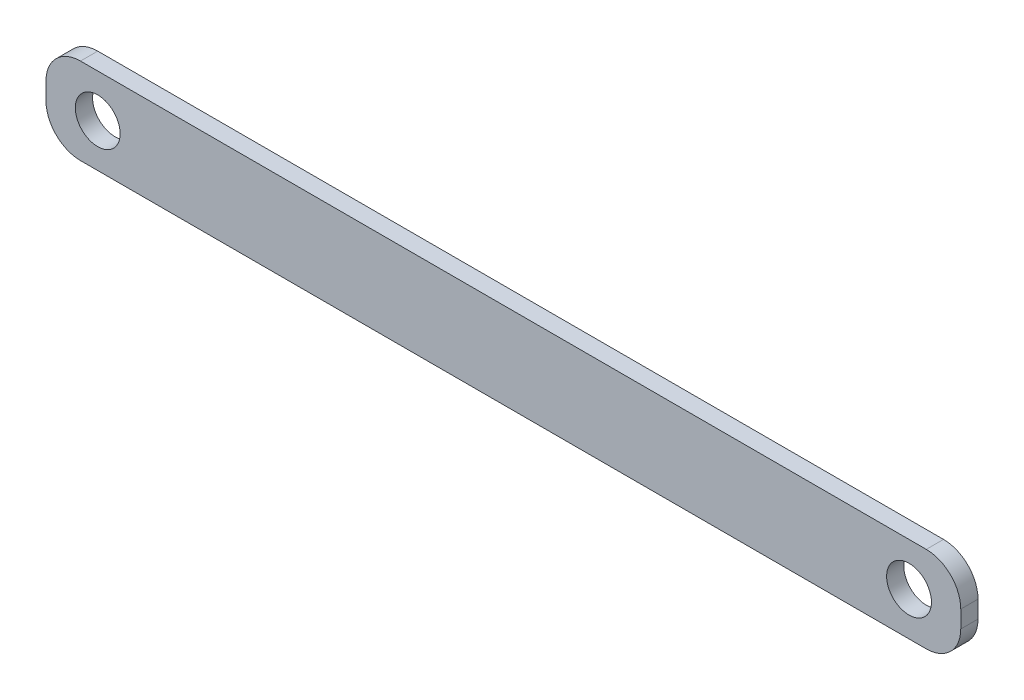
ISO-10303-21;
HEADER;
FILE_DESCRIPTION(('STEP AP214'),'2;1');
FILE_NAME('part.step','',(''),(''),'','','');
FILE_SCHEMA(('AUTOMOTIVE_DESIGN { 1 0 10303 214 1 1 1 1 }'));
ENDSEC;
DATA;
#1=APPLICATION_CONTEXT('core data for automotive mechanical design processes');
#2=APPLICATION_PROTOCOL_DEFINITION('international standard','automotive_design',2000,#1);
#3=PRODUCT_CONTEXT('',#1,'mechanical');
#4=PRODUCT('Part','Part','',(#3));
#5=PRODUCT_RELATED_PRODUCT_CATEGORY('part','',(#4));
#6=PRODUCT_DEFINITION_FORMATION('','',#4);
#7=PRODUCT_DEFINITION_CONTEXT('part definition',#1,'design');
#8=PRODUCT_DEFINITION('design','',#6,#7);
#9=PRODUCT_DEFINITION_SHAPE('','',#8);
#10=(LENGTH_UNIT() NAMED_UNIT(*) SI_UNIT(.MILLI.,.METRE.));
#11=(NAMED_UNIT(*) PLANE_ANGLE_UNIT() SI_UNIT($,.RADIAN.));
#12=(NAMED_UNIT(*) SI_UNIT($,.STERADIAN.) SOLID_ANGLE_UNIT());
#13=UNCERTAINTY_MEASURE_WITH_UNIT(LENGTH_MEASURE(1.E-05),#10,'distance_accuracy_value','');
#14=(GEOMETRIC_REPRESENTATION_CONTEXT(3) GLOBAL_UNCERTAINTY_ASSIGNED_CONTEXT((#13)) GLOBAL_UNIT_ASSIGNED_CONTEXT((#10,
#11,#12)) REPRESENTATION_CONTEXT('',''));
#15=CARTESIAN_POINT('',(0.,0.,0.));
#16=DIRECTION('',(0.,0.,1.));
#17=DIRECTION('',(1.,0.,0.));
#18=AXIS2_PLACEMENT_3D('',#15,#16,#17);
#19=CARTESIAN_POINT('',(120.,-2.5,2.5));
#20=DIRECTION('',(0.,0.,1.));
#21=DIRECTION('',(1.,0.,0.));
#22=AXIS2_PLACEMENT_3D('',#19,#20,#21);
#23=PLANE('',#22);
#24=CARTESIAN_POINT('',(115.,0.,2.5));
#25=DIRECTION('',(0.,0.,1.));
#26=DIRECTION('',(1.,0.,0.));
#27=AXIS2_PLACEMENT_3D('',#24,#25,#26);
#28=CIRCLE('',#27,6.50000000000002);
#29=CARTESIAN_POINT('',(121.5,0.,2.5));
#30=VERTEX_POINT('',#29);
#31=EDGE_CURVE('E134',#30,#30,#28,.T.);
#32=ORIENTED_EDGE('',*,*,#31,.F.);
#33=EDGE_LOOP('',(#32));
#34=FACE_BOUND('',#33,.T.);
#35=CARTESIAN_POINT('',(120.,-2.5,2.5));
#36=DIRECTION('',(0.,0.,1.));
#37=DIRECTION('',(1.,0.,0.));
#38=AXIS2_PLACEMENT_3D('',#35,#36,#37);
#39=CIRCLE('',#38,10.);
#40=CARTESIAN_POINT('',(120.,-12.5,2.5));
#41=VERTEX_POINT('',#40);
#42=CARTESIAN_POINT('',(130.,-2.5,2.5));
#43=VERTEX_POINT('',#42);
#44=EDGE_CURVE('E145',#41,#43,#39,.T.);
#45=ORIENTED_EDGE('',*,*,#44,.T.);
#46=DIRECTION('',(0.,1.,0.));
#47=VECTOR('',#46,1.);
#48=CARTESIAN_POINT('',(130.,2.4999999999999,2.5));
#49=LINE('',#48,#47);
#50=CARTESIAN_POINT('',(130.,2.4999999999999,2.5));
#51=VERTEX_POINT('',#50);
#52=EDGE_CURVE('E93',#43,#51,#49,.T.);
#53=ORIENTED_EDGE('',*,*,#52,.T.);
#54=CARTESIAN_POINT('',(120.,2.4999999999999,2.5));
#55=DIRECTION('',(0.,0.,1.));
#56=DIRECTION('',(-1.,0.,0.));
#57=AXIS2_PLACEMENT_3D('',#54,#55,#56);
#58=CIRCLE('',#57,10.);
#59=CARTESIAN_POINT('',(120.,12.4999999999999,2.5));
#60=VERTEX_POINT('',#59);
#61=EDGE_CURVE('E160',#51,#60,#58,.T.);
#62=ORIENTED_EDGE('',*,*,#61,.T.);
#63=DIRECTION('',(-1.,0.,0.));
#64=VECTOR('',#63,1.);
#65=CARTESIAN_POINT('',(-125.22896295,12.4999999999999,2.5));
#66=LINE('',#65,#64);
#67=CARTESIAN_POINT('',(-125.22896295,12.4999999999999,2.5));
#68=VERTEX_POINT('',#67);
#69=EDGE_CURVE('E173',#60,#68,#66,.T.);
#70=ORIENTED_EDGE('',*,*,#69,.T.);
#71=CARTESIAN_POINT('',(-125.22896295,2.4999999999999,2.5));
#72=DIRECTION('',(0.,0.,1.));
#73=DIRECTION('',(1.,0.,0.));
#74=AXIS2_PLACEMENT_3D('',#71,#72,#73);
#75=CIRCLE('',#74,10.);
#76=CARTESIAN_POINT('',(-135.22896295,2.4999999999999,2.5));
#77=VERTEX_POINT('',#76);
#78=EDGE_CURVE('E112',#68,#77,#75,.T.);
#79=ORIENTED_EDGE('',*,*,#78,.T.);
#80=DIRECTION('',(0.,-1.,0.));
#81=VECTOR('',#80,1.);
#82=CARTESIAN_POINT('',(-135.22896295,2.4999999999999,2.5));
#83=LINE('',#82,#81);
#84=CARTESIAN_POINT('',(-135.22896295,-2.5,2.5));
#85=VERTEX_POINT('',#84);
#86=EDGE_CURVE('E106',#77,#85,#83,.T.);
#87=ORIENTED_EDGE('',*,*,#86,.T.);
#88=CARTESIAN_POINT('',(-125.22896295,-2.5,2.5));
#89=DIRECTION('',(0.,0.,1.));
#90=DIRECTION('',(1.,0.,0.));
#91=AXIS2_PLACEMENT_3D('',#88,#89,#90);
#92=CIRCLE('',#91,10.);
#93=CARTESIAN_POINT('',(-125.22896295,-12.5,2.5));
#94=VERTEX_POINT('',#93);
#95=EDGE_CURVE('E110',#85,#94,#92,.T.);
#96=ORIENTED_EDGE('',*,*,#95,.T.);
#97=DIRECTION('',(1.,0.,0.));
#98=VECTOR('',#97,1.);
#99=CARTESIAN_POINT('',(-125.22896295,-12.5,2.5));
#100=LINE('',#99,#98);
#101=EDGE_CURVE('E50',#94,#41,#100,.T.);
#102=ORIENTED_EDGE('',*,*,#101,.T.);
#103=EDGE_LOOP('',(#45,#53,#62,#70,#79,#87,#96,#102));
#104=FACE_BOUND('',#103,.T.);
#105=CARTESIAN_POINT('',(-120.22896295,0.,2.5));
#106=DIRECTION('',(0.,0.,1.));
#107=DIRECTION('',(1.,0.,0.));
#108=AXIS2_PLACEMENT_3D('',#105,#106,#107);
#109=CIRCLE('',#108,6.5);
#110=CARTESIAN_POINT('',(-113.72896295,0.,2.5));
#111=VERTEX_POINT('',#110);
#112=EDGE_CURVE('E182',#111,#111,#109,.T.);
#113=ORIENTED_EDGE('',*,*,#112,.F.);
#114=EDGE_LOOP('',(#113));
#115=FACE_BOUND('',#114,.T.);
#116=ADVANCED_FACE('F33',(#34,#104,#115),#23,.T.);
#117=CARTESIAN_POINT('',(120.,-2.5,-2.5));
#118=DIRECTION('',(0.,0.,1.));
#119=DIRECTION('',(1.,0.,0.));
#120=AXIS2_PLACEMENT_3D('',#117,#118,#119);
#121=PLANE('',#120);
#122=CARTESIAN_POINT('',(120.,-2.5,-2.5));
#123=DIRECTION('',(0.,0.,1.));
#124=DIRECTION('',(1.,0.,0.));
#125=AXIS2_PLACEMENT_3D('',#122,#123,#124);
#126=CIRCLE('',#125,10.);
#127=CARTESIAN_POINT('',(120.,-12.5,-2.5));
#128=VERTEX_POINT('',#127);
#129=CARTESIAN_POINT('',(130.,-2.5,-2.5));
#130=VERTEX_POINT('',#129);
#131=EDGE_CURVE('E130',#128,#130,#126,.T.);
#132=ORIENTED_EDGE('',*,*,#131,.F.);
#133=DIRECTION('',(1.,0.,0.));
#134=VECTOR('',#133,1.);
#135=CARTESIAN_POINT('',(-125.22896295,-12.5,-2.5));
#136=LINE('',#135,#134);
#137=CARTESIAN_POINT('',(-125.22896295,-12.5,-2.5));
#138=VERTEX_POINT('',#137);
#139=EDGE_CURVE('E85',#138,#128,#136,.T.);
#140=ORIENTED_EDGE('',*,*,#139,.F.);
#141=CARTESIAN_POINT('',(-125.22896295,-2.5,-2.5));
#142=DIRECTION('',(0.,0.,1.));
#143=DIRECTION('',(1.,0.,0.));
#144=AXIS2_PLACEMENT_3D('',#141,#142,#143);
#145=CIRCLE('',#144,10.);
#146=CARTESIAN_POINT('',(-135.22896295,-2.5,-2.5));
#147=VERTEX_POINT('',#146);
#148=EDGE_CURVE('E79',#147,#138,#145,.T.);
#149=ORIENTED_EDGE('',*,*,#148,.F.);
#150=DIRECTION('',(0.,-1.,0.));
#151=VECTOR('',#150,1.);
#152=CARTESIAN_POINT('',(-135.22896295,2.4999999999999,-2.5));
#153=LINE('',#152,#151);
#154=CARTESIAN_POINT('',(-135.22896295,2.4999999999999,-2.5));
#155=VERTEX_POINT('',#154);
#156=EDGE_CURVE('E120',#155,#147,#153,.T.);
#157=ORIENTED_EDGE('',*,*,#156,.F.);
#158=CARTESIAN_POINT('',(-125.22896295,2.4999999999999,-2.5));
#159=DIRECTION('',(0.,0.,1.));
#160=DIRECTION('',(1.,0.,0.));
#161=AXIS2_PLACEMENT_3D('',#158,#159,#160);
#162=CIRCLE('',#161,10.);
#163=CARTESIAN_POINT('',(-125.22896295,12.4999999999999,-2.5));
#164=VERTEX_POINT('',#163);
#165=EDGE_CURVE('E140',#164,#155,#162,.T.);
#166=ORIENTED_EDGE('',*,*,#165,.F.);
#167=DIRECTION('',(-1.,0.,0.));
#168=VECTOR('',#167,1.);
#169=CARTESIAN_POINT('',(-125.22896295,12.4999999999999,-2.5));
#170=LINE('',#169,#168);
#171=CARTESIAN_POINT('',(120.,12.4999999999999,-2.5));
#172=VERTEX_POINT('',#171);
#173=EDGE_CURVE('E138',#172,#164,#170,.T.);
#174=ORIENTED_EDGE('',*,*,#173,.F.);
#175=CARTESIAN_POINT('',(120.,2.4999999999999,-2.5));
#176=DIRECTION('',(0.,0.,1.));
#177=DIRECTION('',(-1.,0.,0.));
#178=AXIS2_PLACEMENT_3D('',#175,#176,#177);
#179=CIRCLE('',#178,10.);
#180=CARTESIAN_POINT('',(130.,2.4999999999999,-2.5));
#181=VERTEX_POINT('',#180);
#182=EDGE_CURVE('E136',#181,#172,#179,.T.);
#183=ORIENTED_EDGE('',*,*,#182,.F.);
#184=DIRECTION('',(0.,1.,0.));
#185=VECTOR('',#184,1.);
#186=CARTESIAN_POINT('',(130.,2.4999999999999,-2.5));
#187=LINE('',#186,#185);
#188=EDGE_CURVE('E133',#130,#181,#187,.T.);
#189=ORIENTED_EDGE('',*,*,#188,.F.);
#190=EDGE_LOOP('',(#132,#140,#149,#157,#166,#174,#183,#189));
#191=FACE_BOUND('',#190,.T.);
#192=CARTESIAN_POINT('',(115.,0.,-2.5));
#193=DIRECTION('',(0.,0.,1.));
#194=DIRECTION('',(1.,0.,0.));
#195=AXIS2_PLACEMENT_3D('',#192,#193,#194);
#196=CIRCLE('',#195,6.50000000000002);
#197=CARTESIAN_POINT('',(121.5,0.,-2.5));
#198=VERTEX_POINT('',#197);
#199=EDGE_CURVE('E179',#198,#198,#196,.T.);
#200=ORIENTED_EDGE('',*,*,#199,.T.);
#201=EDGE_LOOP('',(#200));
#202=FACE_BOUND('',#201,.T.);
#203=CARTESIAN_POINT('',(-120.22896295,0.,-2.5));
#204=DIRECTION('',(0.,0.,1.));
#205=DIRECTION('',(1.,0.,0.));
#206=AXIS2_PLACEMENT_3D('',#203,#204,#205);
#207=CIRCLE('',#206,6.5);
#208=CARTESIAN_POINT('',(-113.72896295,0.,-2.5));
#209=VERTEX_POINT('',#208);
#210=EDGE_CURVE('E185',#209,#209,#207,.T.);
#211=ORIENTED_EDGE('',*,*,#210,.T.);
#212=EDGE_LOOP('',(#211));
#213=FACE_BOUND('',#212,.T.);
#214=ADVANCED_FACE('F164',(#191,#202,#213),#121,.F.);
#215=CARTESIAN_POINT('',(120.,-2.5,2.5));
#216=DIRECTION('',(0.,0.,-1.));
#217=DIRECTION('',(-1.,0.,0.));
#218=AXIS2_PLACEMENT_3D('',#215,#216,#217);
#219=CYLINDRICAL_SURFACE('',#218,10.);
#220=ORIENTED_EDGE('',*,*,#131,.T.);
#221=DIRECTION('',(0.,0.,-1.));
#222=VECTOR('',#221,1.);
#223=CARTESIAN_POINT('',(130.,-2.5,2.5));
#224=LINE('',#223,#222);
#225=EDGE_CURVE('E11',#43,#130,#224,.T.);
#226=ORIENTED_EDGE('',*,*,#225,.F.);
#227=ORIENTED_EDGE('',*,*,#44,.F.);
#228=DIRECTION('',(0.,0.,-1.));
#229=VECTOR('',#228,1.);
#230=CARTESIAN_POINT('',(120.,-12.5,2.5));
#231=LINE('',#230,#229);
#232=EDGE_CURVE('E126',#41,#128,#231,.T.);
#233=ORIENTED_EDGE('',*,*,#232,.T.);
#234=EDGE_LOOP('',(#220,#226,#227,#233));
#235=FACE_BOUND('',#234,.T.);
#236=ADVANCED_FACE('F35',(#235),#219,.T.);
#237=CARTESIAN_POINT('',(130.,2.4999999999999,2.5));
#238=DIRECTION('',(-1.,0.,0.));
#239=DIRECTION('',(0.,0.,1.));
#240=AXIS2_PLACEMENT_3D('',#237,#238,#239);
#241=PLANE('',#240);
#242=ORIENTED_EDGE('',*,*,#188,.T.);
#243=DIRECTION('',(0.,0.,-1.));
#244=VECTOR('',#243,1.);
#245=CARTESIAN_POINT('',(130.,2.4999999999999,2.5));
#246=LINE('',#245,#244);
#247=EDGE_CURVE('E42',#51,#181,#246,.T.);
#248=ORIENTED_EDGE('',*,*,#247,.F.);
#249=ORIENTED_EDGE('',*,*,#52,.F.);
#250=ORIENTED_EDGE('',*,*,#225,.T.);
#251=EDGE_LOOP('',(#242,#248,#249,#250));
#252=FACE_BOUND('',#251,.T.);
#253=ADVANCED_FACE('F217',(#252),#241,.F.);
#254=CARTESIAN_POINT('',(120.,2.4999999999999,2.5));
#255=DIRECTION('',(0.,0.,-1.));
#256=DIRECTION('',(-1.,0.,0.));
#257=AXIS2_PLACEMENT_3D('',#254,#255,#256);
#258=CYLINDRICAL_SURFACE('',#257,10.);
#259=ORIENTED_EDGE('',*,*,#182,.T.);
#260=DIRECTION('',(0.,0.,-1.));
#261=VECTOR('',#260,1.);
#262=CARTESIAN_POINT('',(120.,12.4999999999999,2.5));
#263=LINE('',#262,#261);
#264=EDGE_CURVE('E152',#60,#172,#263,.T.);
#265=ORIENTED_EDGE('',*,*,#264,.F.);
#266=ORIENTED_EDGE('',*,*,#61,.F.);
#267=ORIENTED_EDGE('',*,*,#247,.T.);
#268=EDGE_LOOP('',(#259,#265,#266,#267));
#269=FACE_BOUND('',#268,.T.);
#270=ADVANCED_FACE('F158',(#269),#258,.T.);
#271=CARTESIAN_POINT('',(-125.22896295,12.4999999999999,2.5));
#272=DIRECTION('',(0.,-1.,0.));
#273=DIRECTION('',(1.,0.,0.));
#274=AXIS2_PLACEMENT_3D('',#271,#272,#273);
#275=PLANE('',#274);
#276=ORIENTED_EDGE('',*,*,#173,.T.);
#277=DIRECTION('',(0.,0.,-1.));
#278=VECTOR('',#277,1.);
#279=CARTESIAN_POINT('',(-125.22896295,12.4999999999999,2.5));
#280=LINE('',#279,#278);
#281=EDGE_CURVE('E149',#68,#164,#280,.T.);
#282=ORIENTED_EDGE('',*,*,#281,.F.);
#283=ORIENTED_EDGE('',*,*,#69,.F.);
#284=ORIENTED_EDGE('',*,*,#264,.T.);
#285=EDGE_LOOP('',(#276,#282,#283,#284));
#286=FACE_BOUND('',#285,.T.);
#287=ADVANCED_FACE('F169',(#286),#275,.F.);
#288=CARTESIAN_POINT('',(-125.22896295,2.4999999999999,2.5));
#289=DIRECTION('',(0.,0.,-1.));
#290=DIRECTION('',(-1.,0.,0.));
#291=AXIS2_PLACEMENT_3D('',#288,#289,#290);
#292=CYLINDRICAL_SURFACE('',#291,10.);
#293=ORIENTED_EDGE('',*,*,#165,.T.);
#294=DIRECTION('',(0.,0.,-1.));
#295=VECTOR('',#294,1.);
#296=CARTESIAN_POINT('',(-135.22896295,2.4999999999999,2.5));
#297=LINE('',#296,#295);
#298=EDGE_CURVE('E121',#77,#155,#297,.T.);
#299=ORIENTED_EDGE('',*,*,#298,.F.);
#300=ORIENTED_EDGE('',*,*,#78,.F.);
#301=ORIENTED_EDGE('',*,*,#281,.T.);
#302=EDGE_LOOP('',(#293,#299,#300,#301));
#303=FACE_BOUND('',#302,.T.);
#304=ADVANCED_FACE('F172',(#303),#292,.T.);
#305=CARTESIAN_POINT('',(-135.22896295,2.4999999999999,2.5));
#306=DIRECTION('',(1.,0.,0.));
#307=DIRECTION('',(0.,0.,-1.));
#308=AXIS2_PLACEMENT_3D('',#305,#306,#307);
#309=PLANE('',#308);
#310=ORIENTED_EDGE('',*,*,#156,.T.);
#311=DIRECTION('',(0.,0.,-1.));
#312=VECTOR('',#311,1.);
#313=CARTESIAN_POINT('',(-135.22896295,-2.5,2.5));
#314=LINE('',#313,#312);
#315=EDGE_CURVE('E117',#85,#147,#314,.T.);
#316=ORIENTED_EDGE('',*,*,#315,.F.);
#317=ORIENTED_EDGE('',*,*,#86,.F.);
#318=ORIENTED_EDGE('',*,*,#298,.T.);
#319=EDGE_LOOP('',(#310,#316,#317,#318));
#320=FACE_BOUND('',#319,.T.);
#321=ADVANCED_FACE('F118',(#320),#309,.F.);
#322=CARTESIAN_POINT('',(-125.22896295,-2.5,2.5));
#323=DIRECTION('',(0.,0.,-1.));
#324=DIRECTION('',(-1.,0.,0.));
#325=AXIS2_PLACEMENT_3D('',#322,#323,#324);
#326=CYLINDRICAL_SURFACE('',#325,10.);
#327=ORIENTED_EDGE('',*,*,#148,.T.);
#328=DIRECTION('',(0.,0.,-1.));
#329=VECTOR('',#328,1.);
#330=CARTESIAN_POINT('',(-125.22896295,-12.5,2.5));
#331=LINE('',#330,#329);
#332=EDGE_CURVE('E122',#94,#138,#331,.T.);
#333=ORIENTED_EDGE('',*,*,#332,.F.);
#334=ORIENTED_EDGE('',*,*,#95,.F.);
#335=ORIENTED_EDGE('',*,*,#315,.T.);
#336=EDGE_LOOP('',(#327,#333,#334,#335));
#337=FACE_BOUND('',#336,.T.);
#338=ADVANCED_FACE('F124',(#337),#326,.T.);
#339=CARTESIAN_POINT('',(-125.22896295,-12.5,2.5));
#340=DIRECTION('',(0.,1.,0.));
#341=DIRECTION('',(-1.,0.,0.));
#342=AXIS2_PLACEMENT_3D('',#339,#340,#341);
#343=PLANE('',#342);
#344=ORIENTED_EDGE('',*,*,#139,.T.);
#345=ORIENTED_EDGE('',*,*,#232,.F.);
#346=ORIENTED_EDGE('',*,*,#101,.F.);
#347=ORIENTED_EDGE('',*,*,#332,.T.);
#348=EDGE_LOOP('',(#344,#345,#346,#347));
#349=FACE_BOUND('',#348,.T.);
#350=ADVANCED_FACE('F205',(#349),#343,.F.);
#351=CARTESIAN_POINT('',(115.,0.,2.5));
#352=DIRECTION('',(0.,0.,-1.));
#353=DIRECTION('',(-1.,0.,0.));
#354=AXIS2_PLACEMENT_3D('',#351,#352,#353);
#355=CYLINDRICAL_SURFACE('',#354,6.50000000000002);
#356=ORIENTED_EDGE('',*,*,#31,.T.);
#357=EDGE_LOOP('',(#356));
#358=FACE_BOUND('',#357,.T.);
#359=ORIENTED_EDGE('',*,*,#199,.F.);
#360=EDGE_LOOP('',(#359));
#361=FACE_BOUND('',#360,.T.);
#362=ADVANCED_FACE('F202',(#358,#361),#355,.F.);
#363=CARTESIAN_POINT('',(-120.22896295,0.,2.5));
#364=DIRECTION('',(0.,0.,-1.));
#365=DIRECTION('',(-1.,0.,0.));
#366=AXIS2_PLACEMENT_3D('',#363,#364,#365);
#367=CYLINDRICAL_SURFACE('',#366,6.5);
#368=ORIENTED_EDGE('',*,*,#112,.T.);
#369=EDGE_LOOP('',(#368));
#370=FACE_BOUND('',#369,.T.);
#371=ORIENTED_EDGE('',*,*,#210,.F.);
#372=EDGE_LOOP('',(#371));
#373=FACE_BOUND('',#372,.T.);
#374=ADVANCED_FACE('F191',(#370,#373),#367,.F.);
#375=CLOSED_SHELL('',(#116,#214,#236,#253,#270,#287,#304,#321,#338,#350,#362,#374));
#376=MANIFOLD_SOLID_BREP('B2',#375);
#377=ADVANCED_BREP_SHAPE_REPRESENTATION('',(#18,#376),#14);
#378=SHAPE_DEFINITION_REPRESENTATION(#9,#377);
ENDSEC;
END-ISO-10303-21;
